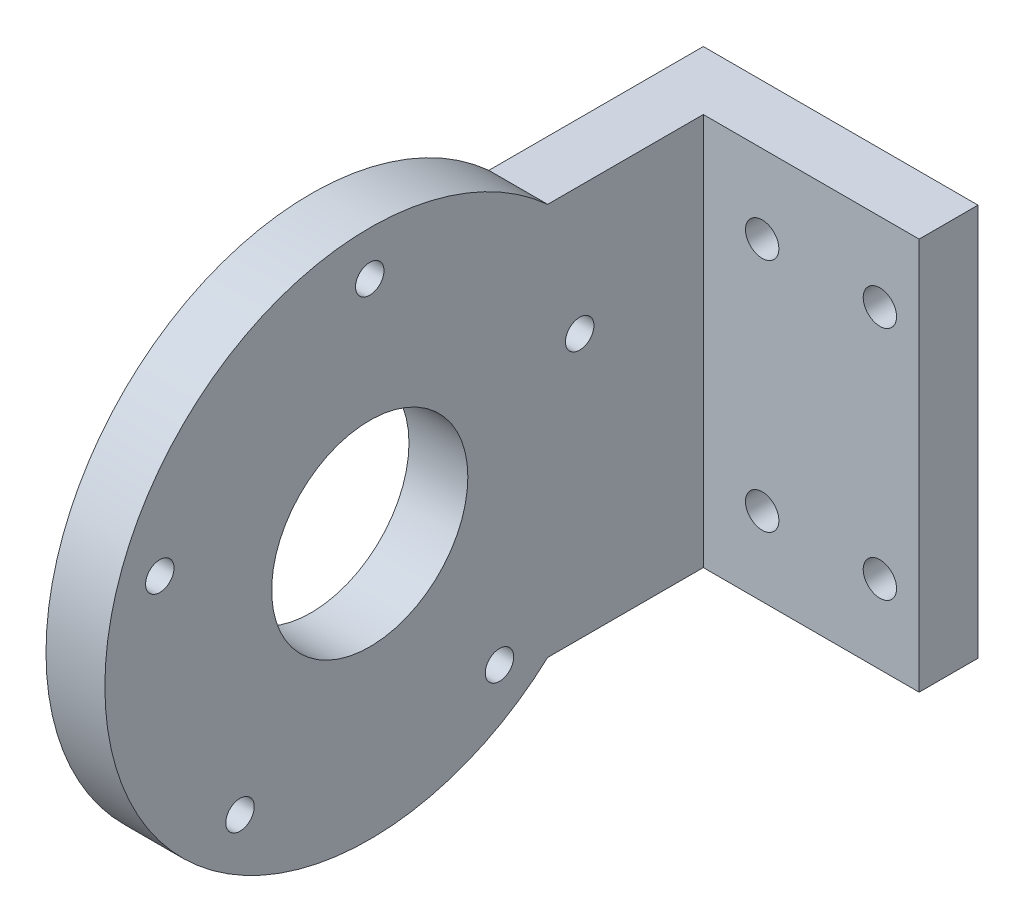
ISO-10303-21;
HEADER;
FILE_DESCRIPTION(('STEP AP214'),'2;1');
FILE_NAME('part.step','',(''),(''),'','','');
FILE_SCHEMA(('AUTOMOTIVE_DESIGN { 1 0 10303 214 1 1 1 1 }'));
ENDSEC;
DATA;
#1=APPLICATION_CONTEXT('core data for automotive mechanical design processes');
#2=APPLICATION_PROTOCOL_DEFINITION('international standard','automotive_design',2000,#1);
#3=PRODUCT_CONTEXT('',#1,'mechanical');
#4=PRODUCT('Part','Part','',(#3));
#5=PRODUCT_RELATED_PRODUCT_CATEGORY('part','',(#4));
#6=PRODUCT_DEFINITION_FORMATION('','',#4);
#7=PRODUCT_DEFINITION_CONTEXT('part definition',#1,'design');
#8=PRODUCT_DEFINITION('design','',#6,#7);
#9=PRODUCT_DEFINITION_SHAPE('','',#8);
#10=(LENGTH_UNIT() NAMED_UNIT(*) SI_UNIT(.MILLI.,.METRE.));
#11=(NAMED_UNIT(*) PLANE_ANGLE_UNIT() SI_UNIT($,.RADIAN.));
#12=(NAMED_UNIT(*) SI_UNIT($,.STERADIAN.) SOLID_ANGLE_UNIT());
#13=UNCERTAINTY_MEASURE_WITH_UNIT(LENGTH_MEASURE(1.E-05),#10,'distance_accuracy_value','');
#14=(GEOMETRIC_REPRESENTATION_CONTEXT(3) GLOBAL_UNCERTAINTY_ASSIGNED_CONTEXT((#13)) GLOBAL_UNIT_ASSIGNED_CONTEXT((#10,
#11,#12)) REPRESENTATION_CONTEXT('',''));
#15=CARTESIAN_POINT('',(0.,0.,0.));
#16=DIRECTION('',(0.,0.,1.));
#17=DIRECTION('',(1.,0.,0.));
#18=AXIS2_PLACEMENT_3D('',#15,#16,#17);
#19=CARTESIAN_POINT('',(227.,300.,300.));
#20=DIRECTION('',(-1.,0.,0.));
#21=DIRECTION('',(0.,0.,1.));
#22=AXIS2_PLACEMENT_3D('',#19,#20,#21);
#23=CYLINDRICAL_SURFACE('',#22,27.);
#24=DIRECTION('',(-1.,0.,0.));
#25=VECTOR('',#24,1.);
#26=CARTESIAN_POINT('',(227.,320.,281.861642852783));
#27=LINE('',#26,#25);
#28=CARTESIAN_POINT('',(221.,320.,281.861642852783));
#29=VERTEX_POINT('',#28);
#30=CARTESIAN_POINT('',(227.,320.,281.861642852783));
#31=VERTEX_POINT('',#30);
#32=EDGE_CURVE('E176',#29,#31,#27,.F.);
#33=ORIENTED_EDGE('',*,*,#32,.F.);
#34=CARTESIAN_POINT('',(221.,300.,300.));
#35=DIRECTION('',(1.,0.,0.));
#36=DIRECTION('',(0.,0.,-1.));
#37=AXIS2_PLACEMENT_3D('',#34,#35,#36);
#38=CIRCLE('',#37,27.);
#39=CARTESIAN_POINT('',(221.,280.,281.861642852783));
#40=VERTEX_POINT('',#39);
#41=EDGE_CURVE('E42',#29,#40,#38,.T.);
#42=ORIENTED_EDGE('',*,*,#41,.T.);
#43=DIRECTION('',(-1.,0.,0.));
#44=VECTOR('',#43,1.);
#45=CARTESIAN_POINT('',(227.,280.,281.861642852783));
#46=LINE('',#45,#44);
#47=CARTESIAN_POINT('',(227.,280.,281.861642852783));
#48=VERTEX_POINT('',#47);
#49=EDGE_CURVE('E60',#48,#40,#46,.T.);
#50=ORIENTED_EDGE('',*,*,#49,.F.);
#51=CARTESIAN_POINT('',(227.,300.,300.));
#52=DIRECTION('',(1.,0.,0.));
#53=DIRECTION('',(0.,0.,-1.));
#54=AXIS2_PLACEMENT_3D('',#51,#52,#53);
#55=CIRCLE('',#54,27.);
#56=EDGE_CURVE('E11',#31,#48,#55,.T.);
#57=ORIENTED_EDGE('',*,*,#56,.F.);
#58=EDGE_LOOP('',(#33,#42,#50,#57));
#59=FACE_BOUND('',#58,.T.);
#60=ADVANCED_FACE('F39',(#59),#23,.T.);
#61=CARTESIAN_POINT('',(227.,300.,300.));
#62=DIRECTION('',(1.,0.,0.));
#63=DIRECTION('',(0.,0.,-1.));
#64=AXIS2_PLACEMENT_3D('',#61,#62,#63);
#65=PLANE('',#64);
#66=DIRECTION('',(0.,-1.,0.));
#67=VECTOR('',#66,1.);
#68=CARTESIAN_POINT('',(227.,300.,266.));
#69=LINE('',#68,#67);
#70=CARTESIAN_POINT('',(227.,320.,266.));
#71=VERTEX_POINT('',#70);
#72=CARTESIAN_POINT('',(227.,280.,266.));
#73=VERTEX_POINT('',#72);
#74=EDGE_CURVE('E99',#71,#73,#69,.T.);
#75=ORIENTED_EDGE('',*,*,#74,.F.);
#76=DIRECTION('',(0.,0.,1.));
#77=VECTOR('',#76,1.);
#78=CARTESIAN_POINT('',(227.,320.,285.));
#79=LINE('',#78,#77);
#80=EDGE_CURVE('E162',#71,#31,#79,.T.);
#81=ORIENTED_EDGE('',*,*,#80,.T.);
#82=ORIENTED_EDGE('',*,*,#56,.T.);
#83=DIRECTION('',(0.,0.,-1.));
#84=VECTOR('',#83,1.);
#85=CARTESIAN_POINT('',(227.,280.,260.));
#86=LINE('',#85,#84);
#87=EDGE_CURVE('E52',#48,#73,#86,.T.);
#88=ORIENTED_EDGE('',*,*,#87,.T.);
#89=EDGE_LOOP('',(#75,#81,#82,#88));
#90=FACE_BOUND('',#89,.T.);
#91=CARTESIAN_POINT('',(227.,306.952882373436,321.398771616641));
#92=DIRECTION('',(1.,0.,0.));
#93=DIRECTION('',(0.,0.,-1.));
#94=AXIS2_PLACEMENT_3D('',#91,#92,#93);
#95=CIRCLE('',#94,1.45000000000001);
#96=CARTESIAN_POINT('',(227.,306.952882373436,319.948771616641));
#97=VERTEX_POINT('',#96);
#98=EDGE_CURVE('E158',#97,#97,#95,.F.);
#99=ORIENTED_EDGE('',*,*,#98,.T.);
#100=EDGE_LOOP('',(#99));
#101=FACE_BOUND('',#100,.T.);
#102=CARTESIAN_POINT('',(227.,281.797117626564,313.225168176581));
#103=DIRECTION('',(1.,0.,0.));
#104=DIRECTION('',(0.,0.,-1.));
#105=AXIS2_PLACEMENT_3D('',#102,#103,#104);
#106=CIRCLE('',#105,1.45000000000001);
#107=CARTESIAN_POINT('',(227.,281.797117626564,311.775168176581));
#108=VERTEX_POINT('',#107);
#109=EDGE_CURVE('E155',#108,#108,#106,.F.);
#110=ORIENTED_EDGE('',*,*,#109,.T.);
#111=EDGE_LOOP('',(#110));
#112=FACE_BOUND('',#111,.T.);
#113=CARTESIAN_POINT('',(227.,281.797117626564,286.774831823419));
#114=DIRECTION('',(1.,0.,0.));
#115=DIRECTION('',(0.,0.,-1.));
#116=AXIS2_PLACEMENT_3D('',#113,#114,#115);
#117=CIRCLE('',#116,1.45000000000001);
#118=CARTESIAN_POINT('',(227.,281.797117626564,285.324831823419));
#119=VERTEX_POINT('',#118);
#120=EDGE_CURVE('E152',#119,#119,#117,.F.);
#121=ORIENTED_EDGE('',*,*,#120,.T.);
#122=EDGE_LOOP('',(#121));
#123=FACE_BOUND('',#122,.T.);
#124=CARTESIAN_POINT('',(227.,306.952882373436,278.601228383359));
#125=DIRECTION('',(1.,0.,0.));
#126=DIRECTION('',(0.,0.,-1.));
#127=AXIS2_PLACEMENT_3D('',#124,#125,#126);
#128=CIRCLE('',#127,1.45000000000001);
#129=CARTESIAN_POINT('',(227.,306.952882373436,277.151228383359));
#130=VERTEX_POINT('',#129);
#131=EDGE_CURVE('E149',#130,#130,#128,.F.);
#132=ORIENTED_EDGE('',*,*,#131,.T.);
#133=EDGE_LOOP('',(#132));
#134=FACE_BOUND('',#133,.T.);
#135=CARTESIAN_POINT('',(227.,322.5,300.));
#136=DIRECTION('',(1.,0.,0.));
#137=DIRECTION('',(0.,0.,-1.));
#138=AXIS2_PLACEMENT_3D('',#135,#136,#137);
#139=CIRCLE('',#138,1.45000000000001);
#140=CARTESIAN_POINT('',(227.,322.5,298.55));
#141=VERTEX_POINT('',#140);
#142=EDGE_CURVE('E146',#141,#141,#139,.F.);
#143=ORIENTED_EDGE('',*,*,#142,.T.);
#144=EDGE_LOOP('',(#143));
#145=FACE_BOUND('',#144,.T.);
#146=CARTESIAN_POINT('',(227.,300.,300.));
#147=DIRECTION('',(1.,0.,0.));
#148=DIRECTION('',(0.,0.,-1.));
#149=AXIS2_PLACEMENT_3D('',#146,#147,#148);
#150=CIRCLE('',#149,10.);
#151=CARTESIAN_POINT('',(227.,300.,290.));
#152=VERTEX_POINT('',#151);
#153=EDGE_CURVE('E143',#152,#152,#150,.F.);
#154=ORIENTED_EDGE('',*,*,#153,.T.);
#155=EDGE_LOOP('',(#154));
#156=FACE_BOUND('',#155,.T.);
#157=ADVANCED_FACE('F189',(#90,#101,#112,#123,#134,#145,#156),#65,.T.);
#158=CARTESIAN_POINT('',(221.,300.,300.));
#159=DIRECTION('',(1.,0.,0.));
#160=DIRECTION('',(0.,0.,-1.));
#161=AXIS2_PLACEMENT_3D('',#158,#159,#160);
#162=PLANE('',#161);
#163=CARTESIAN_POINT('',(221.,306.952882373436,321.398771616641));
#164=DIRECTION('',(1.,0.,0.));
#165=DIRECTION('',(0.,0.,-1.));
#166=AXIS2_PLACEMENT_3D('',#163,#164,#165);
#167=CIRCLE('',#166,1.45000000000001);
#168=CARTESIAN_POINT('',(221.,306.952882373436,319.948771616641));
#169=VERTEX_POINT('',#168);
#170=EDGE_CURVE('E125',#169,#169,#167,.T.);
#171=ORIENTED_EDGE('',*,*,#170,.T.);
#172=EDGE_LOOP('',(#171));
#173=FACE_BOUND('',#172,.T.);
#174=CARTESIAN_POINT('',(221.,281.797117626564,313.225168176581));
#175=DIRECTION('',(1.,0.,0.));
#176=DIRECTION('',(0.,0.,-1.));
#177=AXIS2_PLACEMENT_3D('',#174,#175,#176);
#178=CIRCLE('',#177,1.45000000000001);
#179=CARTESIAN_POINT('',(221.,281.797117626564,311.775168176581));
#180=VERTEX_POINT('',#179);
#181=EDGE_CURVE('E136',#180,#180,#178,.T.);
#182=ORIENTED_EDGE('',*,*,#181,.T.);
#183=EDGE_LOOP('',(#182));
#184=FACE_BOUND('',#183,.T.);
#185=CARTESIAN_POINT('',(221.,281.797117626564,286.774831823419));
#186=DIRECTION('',(1.,0.,0.));
#187=DIRECTION('',(0.,0.,-1.));
#188=AXIS2_PLACEMENT_3D('',#185,#186,#187);
#189=CIRCLE('',#188,1.45000000000001);
#190=CARTESIAN_POINT('',(221.,281.797117626564,285.324831823419));
#191=VERTEX_POINT('',#190);
#192=EDGE_CURVE('E133',#191,#191,#189,.T.);
#193=ORIENTED_EDGE('',*,*,#192,.T.);
#194=EDGE_LOOP('',(#193));
#195=FACE_BOUND('',#194,.T.);
#196=CARTESIAN_POINT('',(221.,306.952882373436,278.601228383359));
#197=DIRECTION('',(1.,0.,0.));
#198=DIRECTION('',(0.,0.,-1.));
#199=AXIS2_PLACEMENT_3D('',#196,#197,#198);
#200=CIRCLE('',#199,1.45000000000001);
#201=CARTESIAN_POINT('',(221.,306.952882373436,277.151228383359));
#202=VERTEX_POINT('',#201);
#203=EDGE_CURVE('E130',#202,#202,#200,.T.);
#204=ORIENTED_EDGE('',*,*,#203,.T.);
#205=EDGE_LOOP('',(#204));
#206=FACE_BOUND('',#205,.T.);
#207=CARTESIAN_POINT('',(221.,322.5,300.));
#208=DIRECTION('',(1.,0.,0.));
#209=DIRECTION('',(0.,0.,-1.));
#210=AXIS2_PLACEMENT_3D('',#207,#208,#209);
#211=CIRCLE('',#210,1.45000000000001);
#212=CARTESIAN_POINT('',(221.,322.5,298.55));
#213=VERTEX_POINT('',#212);
#214=EDGE_CURVE('E126',#213,#213,#211,.T.);
#215=ORIENTED_EDGE('',*,*,#214,.T.);
#216=EDGE_LOOP('',(#215));
#217=FACE_BOUND('',#216,.T.);
#218=CARTESIAN_POINT('',(221.,300.,300.));
#219=DIRECTION('',(1.,0.,0.));
#220=DIRECTION('',(0.,0.,-1.));
#221=AXIS2_PLACEMENT_3D('',#218,#219,#220);
#222=CIRCLE('',#221,10.);
#223=CARTESIAN_POINT('',(221.,300.,290.));
#224=VERTEX_POINT('',#223);
#225=EDGE_CURVE('E129',#224,#224,#222,.T.);
#226=ORIENTED_EDGE('',*,*,#225,.T.);
#227=EDGE_LOOP('',(#226));
#228=FACE_BOUND('',#227,.T.);
#229=ORIENTED_EDGE('',*,*,#41,.F.);
#230=DIRECTION('',(0.,0.,1.));
#231=VECTOR('',#230,1.);
#232=CARTESIAN_POINT('',(221.,320.,285.));
#233=LINE('',#232,#231);
#234=CARTESIAN_POINT('',(221.,320.,260.));
#235=VERTEX_POINT('',#234);
#236=EDGE_CURVE('E168',#235,#29,#233,.T.);
#237=ORIENTED_EDGE('',*,*,#236,.F.);
#238=DIRECTION('',(0.,1.,0.));
#239=VECTOR('',#238,1.);
#240=CARTESIAN_POINT('',(221.,320.,260.));
#241=LINE('',#240,#239);
#242=CARTESIAN_POINT('',(221.,280.,260.));
#243=VERTEX_POINT('',#242);
#244=EDGE_CURVE('E161',#243,#235,#241,.T.);
#245=ORIENTED_EDGE('',*,*,#244,.F.);
#246=DIRECTION('',(0.,0.,-1.));
#247=VECTOR('',#246,1.);
#248=CARTESIAN_POINT('',(221.,280.,260.));
#249=LINE('',#248,#247);
#250=EDGE_CURVE('E164',#40,#243,#249,.T.);
#251=ORIENTED_EDGE('',*,*,#250,.F.);
#252=EDGE_LOOP('',(#229,#237,#245,#251));
#253=FACE_BOUND('',#252,.T.);
#254=ADVANCED_FACE('F184',(#173,#184,#195,#206,#217,#228,#253),#162,.F.);
#255=CARTESIAN_POINT('',(227.,320.,285.));
#256=DIRECTION('',(0.,-1.,0.));
#257=DIRECTION('',(0.,0.,-1.));
#258=AXIS2_PLACEMENT_3D('',#255,#256,#257);
#259=PLANE('',#258);
#260=ORIENTED_EDGE('',*,*,#80,.F.);
#261=DIRECTION('',(-1.,0.,0.));
#262=VECTOR('',#261,1.);
#263=CARTESIAN_POINT('',(249.,320.,266.));
#264=LINE('',#263,#262);
#265=CARTESIAN_POINT('',(249.,320.,266.));
#266=VERTEX_POINT('',#265);
#267=EDGE_CURVE('E116',#266,#71,#264,.T.);
#268=ORIENTED_EDGE('',*,*,#267,.F.);
#269=DIRECTION('',(0.,0.,-1.));
#270=VECTOR('',#269,1.);
#271=CARTESIAN_POINT('',(249.,320.,266.));
#272=LINE('',#271,#270);
#273=CARTESIAN_POINT('',(249.,320.,260.));
#274=VERTEX_POINT('',#273);
#275=EDGE_CURVE('E111',#266,#274,#272,.T.);
#276=ORIENTED_EDGE('',*,*,#275,.T.);
#277=DIRECTION('',(-1.,0.,0.));
#278=VECTOR('',#277,1.);
#279=CARTESIAN_POINT('',(227.,320.,260.));
#280=LINE('',#279,#278);
#281=EDGE_CURVE('E173',#274,#235,#280,.T.);
#282=ORIENTED_EDGE('',*,*,#281,.T.);
#283=ORIENTED_EDGE('',*,*,#236,.T.);
#284=ORIENTED_EDGE('',*,*,#32,.T.);
#285=EDGE_LOOP('',(#260,#268,#276,#282,#283,#284));
#286=FACE_BOUND('',#285,.T.);
#287=ADVANCED_FACE('F188',(#286),#259,.F.);
#288=CARTESIAN_POINT('',(227.,280.,260.));
#289=DIRECTION('',(0.,1.,0.));
#290=DIRECTION('',(0.,0.,1.));
#291=AXIS2_PLACEMENT_3D('',#288,#289,#290);
#292=PLANE('',#291);
#293=DIRECTION('',(-1.,0.,0.));
#294=VECTOR('',#293,1.);
#295=CARTESIAN_POINT('',(227.,280.,260.));
#296=LINE('',#295,#294);
#297=CARTESIAN_POINT('',(249.,280.,260.));
#298=VERTEX_POINT('',#297);
#299=EDGE_CURVE('E107',#298,#243,#296,.T.);
#300=ORIENTED_EDGE('',*,*,#299,.F.);
#301=DIRECTION('',(0.,0.,-1.));
#302=VECTOR('',#301,1.);
#303=CARTESIAN_POINT('',(249.,280.,266.));
#304=LINE('',#303,#302);
#305=CARTESIAN_POINT('',(249.,280.,266.));
#306=VERTEX_POINT('',#305);
#307=EDGE_CURVE('E104',#306,#298,#304,.T.);
#308=ORIENTED_EDGE('',*,*,#307,.F.);
#309=DIRECTION('',(1.,0.,0.));
#310=VECTOR('',#309,1.);
#311=CARTESIAN_POINT('',(226.99,280.,266.));
#312=LINE('',#311,#310);
#313=EDGE_CURVE('E91',#73,#306,#312,.T.);
#314=ORIENTED_EDGE('',*,*,#313,.F.);
#315=ORIENTED_EDGE('',*,*,#87,.F.);
#316=ORIENTED_EDGE('',*,*,#49,.T.);
#317=ORIENTED_EDGE('',*,*,#250,.T.);
#318=EDGE_LOOP('',(#300,#308,#314,#315,#316,#317));
#319=FACE_BOUND('',#318,.T.);
#320=ADVANCED_FACE('F105',(#319),#292,.F.);
#321=CARTESIAN_POINT('',(227.,320.,260.));
#322=DIRECTION('',(0.,0.,1.));
#323=DIRECTION('',(1.,0.,0.));
#324=AXIS2_PLACEMENT_3D('',#321,#322,#323);
#325=PLANE('',#324);
#326=ORIENTED_EDGE('',*,*,#299,.T.);
#327=ORIENTED_EDGE('',*,*,#244,.T.);
#328=ORIENTED_EDGE('',*,*,#281,.F.);
#329=DIRECTION('',(0.,1.,0.));
#330=VECTOR('',#329,1.);
#331=CARTESIAN_POINT('',(249.,280.,260.));
#332=LINE('',#331,#330);
#333=EDGE_CURVE('E101',#298,#274,#332,.T.);
#334=ORIENTED_EDGE('',*,*,#333,.F.);
#335=EDGE_LOOP('',(#326,#327,#328,#334));
#336=FACE_BOUND('',#335,.T.);
#337=CARTESIAN_POINT('',(233.,288.,260.));
#338=DIRECTION('',(0.,0.,1.));
#339=DIRECTION('',(1.,0.,0.));
#340=AXIS2_PLACEMENT_3D('',#337,#338,#339);
#341=CIRCLE('',#340,1.70000000000001);
#342=CARTESIAN_POINT('',(234.7,288.,260.));
#343=VERTEX_POINT('',#342);
#344=EDGE_CURVE('E406',#343,#343,#341,.T.);
#345=ORIENTED_EDGE('',*,*,#344,.T.);
#346=EDGE_LOOP('',(#345));
#347=FACE_BOUND('',#346,.T.);
#348=CARTESIAN_POINT('',(233.,312.,260.));
#349=DIRECTION('',(0.,0.,1.));
#350=DIRECTION('',(1.,0.,0.));
#351=AXIS2_PLACEMENT_3D('',#348,#349,#350);
#352=CIRCLE('',#351,1.70000000000001);
#353=CARTESIAN_POINT('',(234.7,312.,260.));
#354=VERTEX_POINT('',#353);
#355=EDGE_CURVE('E400',#354,#354,#352,.T.);
#356=ORIENTED_EDGE('',*,*,#355,.T.);
#357=EDGE_LOOP('',(#356));
#358=FACE_BOUND('',#357,.T.);
#359=CARTESIAN_POINT('',(245.,288.,260.));
#360=DIRECTION('',(0.,0.,1.));
#361=DIRECTION('',(1.,0.,0.));
#362=AXIS2_PLACEMENT_3D('',#359,#360,#361);
#363=CIRCLE('',#362,1.70000000000001);
#364=CARTESIAN_POINT('',(246.7,288.,260.));
#365=VERTEX_POINT('',#364);
#366=EDGE_CURVE('E394',#365,#365,#363,.T.);
#367=ORIENTED_EDGE('',*,*,#366,.T.);
#368=EDGE_LOOP('',(#367));
#369=FACE_BOUND('',#368,.T.);
#370=CARTESIAN_POINT('',(245.,312.,260.));
#371=DIRECTION('',(0.,0.,1.));
#372=DIRECTION('',(1.,0.,0.));
#373=AXIS2_PLACEMENT_3D('',#370,#371,#372);
#374=CIRCLE('',#373,1.70000000000001);
#375=CARTESIAN_POINT('',(246.7,312.,260.));
#376=VERTEX_POINT('',#375);
#377=EDGE_CURVE('E391',#376,#376,#374,.T.);
#378=ORIENTED_EDGE('',*,*,#377,.T.);
#379=EDGE_LOOP('',(#378));
#380=FACE_BOUND('',#379,.T.);
#381=ADVANCED_FACE('F186',(#336,#347,#358,#369,#380),#325,.F.);
#382=CARTESIAN_POINT('',(227.01,300.,300.));
#383=DIRECTION('',(-1.,0.,0.));
#384=DIRECTION('',(0.,0.,1.));
#385=AXIS2_PLACEMENT_3D('',#382,#383,#384);
#386=CYLINDRICAL_SURFACE('',#385,10.);
#387=ORIENTED_EDGE('',*,*,#153,.F.);
#388=EDGE_LOOP('',(#387));
#389=FACE_BOUND('',#388,.T.);
#390=ORIENTED_EDGE('',*,*,#225,.F.);
#391=EDGE_LOOP('',(#390));
#392=FACE_BOUND('',#391,.T.);
#393=ADVANCED_FACE('F205',(#389,#392),#386,.F.);
#394=CARTESIAN_POINT('',(227.01,322.5,300.));
#395=DIRECTION('',(-1.,0.,0.));
#396=DIRECTION('',(0.,0.,1.));
#397=AXIS2_PLACEMENT_3D('',#394,#395,#396);
#398=CYLINDRICAL_SURFACE('',#397,1.45000000000001);
#399=ORIENTED_EDGE('',*,*,#142,.F.);
#400=EDGE_LOOP('',(#399));
#401=FACE_BOUND('',#400,.T.);
#402=ORIENTED_EDGE('',*,*,#214,.F.);
#403=EDGE_LOOP('',(#402));
#404=FACE_BOUND('',#403,.T.);
#405=ADVANCED_FACE('F208',(#401,#404),#398,.F.);
#406=CARTESIAN_POINT('',(227.01,306.952882373436,278.601228383359));
#407=DIRECTION('',(-1.,0.,0.));
#408=DIRECTION('',(0.,0.,1.));
#409=AXIS2_PLACEMENT_3D('',#406,#407,#408);
#410=CYLINDRICAL_SURFACE('',#409,1.45000000000001);
#411=ORIENTED_EDGE('',*,*,#131,.F.);
#412=EDGE_LOOP('',(#411));
#413=FACE_BOUND('',#412,.T.);
#414=ORIENTED_EDGE('',*,*,#203,.F.);
#415=EDGE_LOOP('',(#414));
#416=FACE_BOUND('',#415,.T.);
#417=ADVANCED_FACE('F263',(#413,#416),#410,.F.);
#418=CARTESIAN_POINT('',(227.01,281.797117626564,286.774831823419));
#419=DIRECTION('',(-1.,0.,0.));
#420=DIRECTION('',(0.,0.,1.));
#421=AXIS2_PLACEMENT_3D('',#418,#419,#420);
#422=CYLINDRICAL_SURFACE('',#421,1.45000000000001);
#423=ORIENTED_EDGE('',*,*,#120,.F.);
#424=EDGE_LOOP('',(#423));
#425=FACE_BOUND('',#424,.T.);
#426=ORIENTED_EDGE('',*,*,#192,.F.);
#427=EDGE_LOOP('',(#426));
#428=FACE_BOUND('',#427,.T.);
#429=ADVANCED_FACE('F272',(#425,#428),#422,.F.);
#430=CARTESIAN_POINT('',(227.01,281.797117626564,313.225168176581));
#431=DIRECTION('',(-1.,0.,0.));
#432=DIRECTION('',(0.,0.,1.));
#433=AXIS2_PLACEMENT_3D('',#430,#431,#432);
#434=CYLINDRICAL_SURFACE('',#433,1.45000000000001);
#435=ORIENTED_EDGE('',*,*,#109,.F.);
#436=EDGE_LOOP('',(#435));
#437=FACE_BOUND('',#436,.T.);
#438=ORIENTED_EDGE('',*,*,#181,.F.);
#439=EDGE_LOOP('',(#438));
#440=FACE_BOUND('',#439,.T.);
#441=ADVANCED_FACE('F281',(#437,#440),#434,.F.);
#442=CARTESIAN_POINT('',(227.01,306.952882373436,321.398771616641));
#443=DIRECTION('',(-1.,0.,0.));
#444=DIRECTION('',(0.,0.,1.));
#445=AXIS2_PLACEMENT_3D('',#442,#443,#444);
#446=CYLINDRICAL_SURFACE('',#445,1.45000000000001);
#447=ORIENTED_EDGE('',*,*,#98,.F.);
#448=EDGE_LOOP('',(#447));
#449=FACE_BOUND('',#448,.T.);
#450=ORIENTED_EDGE('',*,*,#170,.F.);
#451=EDGE_LOOP('',(#450));
#452=FACE_BOUND('',#451,.T.);
#453=ADVANCED_FACE('F290',(#449,#452),#446,.F.);
#454=CARTESIAN_POINT('',(0.,0.,266.));
#455=DIRECTION('',(0.,0.,1.));
#456=DIRECTION('',(1.,0.,0.));
#457=AXIS2_PLACEMENT_3D('',#454,#455,#456);
#458=PLANE('',#457);
#459=CARTESIAN_POINT('',(245.,288.,266.));
#460=DIRECTION('',(0.,0.,1.));
#461=DIRECTION('',(1.,0.,0.));
#462=AXIS2_PLACEMENT_3D('',#459,#460,#461);
#463=CIRCLE('',#462,1.70000000000001);
#464=CARTESIAN_POINT('',(246.7,288.,266.));
#465=VERTEX_POINT('',#464);
#466=EDGE_CURVE('E397',#465,#465,#463,.T.);
#467=ORIENTED_EDGE('',*,*,#466,.F.);
#468=EDGE_LOOP('',(#467));
#469=FACE_BOUND('',#468,.T.);
#470=CARTESIAN_POINT('',(233.,288.,266.));
#471=DIRECTION('',(0.,0.,1.));
#472=DIRECTION('',(1.,0.,0.));
#473=AXIS2_PLACEMENT_3D('',#470,#471,#472);
#474=CIRCLE('',#473,1.70000000000001);
#475=CARTESIAN_POINT('',(234.7,288.,266.));
#476=VERTEX_POINT('',#475);
#477=EDGE_CURVE('E122',#476,#476,#474,.T.);
#478=ORIENTED_EDGE('',*,*,#477,.F.);
#479=EDGE_LOOP('',(#478));
#480=FACE_BOUND('',#479,.T.);
#481=ORIENTED_EDGE('',*,*,#267,.T.);
#482=ORIENTED_EDGE('',*,*,#74,.T.);
#483=ORIENTED_EDGE('',*,*,#313,.T.);
#484=DIRECTION('',(0.,1.,0.));
#485=VECTOR('',#484,1.);
#486=CARTESIAN_POINT('',(249.,280.,266.));
#487=LINE('',#486,#485);
#488=EDGE_CURVE('E97',#306,#266,#487,.T.);
#489=ORIENTED_EDGE('',*,*,#488,.T.);
#490=EDGE_LOOP('',(#481,#482,#483,#489));
#491=FACE_BOUND('',#490,.T.);
#492=CARTESIAN_POINT('',(233.,312.,266.));
#493=DIRECTION('',(0.,0.,1.));
#494=DIRECTION('',(1.,0.,0.));
#495=AXIS2_PLACEMENT_3D('',#492,#493,#494);
#496=CIRCLE('',#495,1.70000000000001);
#497=CARTESIAN_POINT('',(234.7,312.,266.));
#498=VERTEX_POINT('',#497);
#499=EDGE_CURVE('E403',#498,#498,#496,.T.);
#500=ORIENTED_EDGE('',*,*,#499,.F.);
#501=EDGE_LOOP('',(#500));
#502=FACE_BOUND('',#501,.T.);
#503=CARTESIAN_POINT('',(245.,312.,266.));
#504=DIRECTION('',(0.,0.,1.));
#505=DIRECTION('',(1.,0.,0.));
#506=AXIS2_PLACEMENT_3D('',#503,#504,#505);
#507=CIRCLE('',#506,1.70000000000001);
#508=CARTESIAN_POINT('',(246.7,312.,266.));
#509=VERTEX_POINT('',#508);
#510=EDGE_CURVE('E388',#509,#509,#507,.T.);
#511=ORIENTED_EDGE('',*,*,#510,.F.);
#512=EDGE_LOOP('',(#511));
#513=FACE_BOUND('',#512,.T.);
#514=ADVANCED_FACE('F94',(#469,#480,#491,#502,#513),#458,.T.);
#515=CARTESIAN_POINT('',(249.,280.,266.));
#516=DIRECTION('',(-1.,0.,0.));
#517=DIRECTION('',(0.,0.,1.));
#518=AXIS2_PLACEMENT_3D('',#515,#516,#517);
#519=PLANE('',#518);
#520=ORIENTED_EDGE('',*,*,#333,.T.);
#521=ORIENTED_EDGE('',*,*,#275,.F.);
#522=ORIENTED_EDGE('',*,*,#488,.F.);
#523=ORIENTED_EDGE('',*,*,#307,.T.);
#524=EDGE_LOOP('',(#520,#521,#522,#523));
#525=FACE_BOUND('',#524,.T.);
#526=ADVANCED_FACE('F113',(#525),#519,.F.);
#527=CARTESIAN_POINT('',(233.,288.,266.));
#528=DIRECTION('',(0.,0.,-1.));
#529=DIRECTION('',(-1.,0.,0.));
#530=AXIS2_PLACEMENT_3D('',#527,#528,#529);
#531=CYLINDRICAL_SURFACE('',#530,1.70000000000001);
#532=ORIENTED_EDGE('',*,*,#477,.T.);
#533=EDGE_LOOP('',(#532));
#534=FACE_BOUND('',#533,.T.);
#535=ORIENTED_EDGE('',*,*,#344,.F.);
#536=EDGE_LOOP('',(#535));
#537=FACE_BOUND('',#536,.T.);
#538=ADVANCED_FACE('F315',(#534,#537),#531,.F.);
#539=CARTESIAN_POINT('',(233.,312.,266.));
#540=DIRECTION('',(0.,0.,-1.));
#541=DIRECTION('',(-1.,0.,0.));
#542=AXIS2_PLACEMENT_3D('',#539,#540,#541);
#543=CYLINDRICAL_SURFACE('',#542,1.70000000000001);
#544=ORIENTED_EDGE('',*,*,#499,.T.);
#545=EDGE_LOOP('',(#544));
#546=FACE_BOUND('',#545,.T.);
#547=ORIENTED_EDGE('',*,*,#355,.F.);
#548=EDGE_LOOP('',(#547));
#549=FACE_BOUND('',#548,.T.);
#550=ADVANCED_FACE('F323',(#546,#549),#543,.F.);
#551=CARTESIAN_POINT('',(245.,288.,266.));
#552=DIRECTION('',(0.,0.,-1.));
#553=DIRECTION('',(-1.,0.,0.));
#554=AXIS2_PLACEMENT_3D('',#551,#552,#553);
#555=CYLINDRICAL_SURFACE('',#554,1.70000000000001);
#556=ORIENTED_EDGE('',*,*,#466,.T.);
#557=EDGE_LOOP('',(#556));
#558=FACE_BOUND('',#557,.T.);
#559=ORIENTED_EDGE('',*,*,#366,.F.);
#560=EDGE_LOOP('',(#559));
#561=FACE_BOUND('',#560,.T.);
#562=ADVANCED_FACE('F332',(#558,#561),#555,.F.);
#563=CARTESIAN_POINT('',(245.,312.,266.));
#564=DIRECTION('',(0.,0.,-1.));
#565=DIRECTION('',(-1.,0.,0.));
#566=AXIS2_PLACEMENT_3D('',#563,#564,#565);
#567=CYLINDRICAL_SURFACE('',#566,1.70000000000001);
#568=ORIENTED_EDGE('',*,*,#510,.T.);
#569=EDGE_LOOP('',(#568));
#570=FACE_BOUND('',#569,.T.);
#571=ORIENTED_EDGE('',*,*,#377,.F.);
#572=EDGE_LOOP('',(#571));
#573=FACE_BOUND('',#572,.T.);
#574=ADVANCED_FACE('F341',(#570,#573),#567,.F.);
#575=CLOSED_SHELL('',(#60,#157,#254,#287,#320,#381,#393,#405,#417,#429,#441,#453,#514,#526,#538,
#550,#562,#574));
#576=MANIFOLD_SOLID_BREP('B2',#575);
#577=ADVANCED_BREP_SHAPE_REPRESENTATION('',(#18,#576),#14);
#578=SHAPE_DEFINITION_REPRESENTATION(#9,#577);
ENDSEC;
END-ISO-10303-21;
